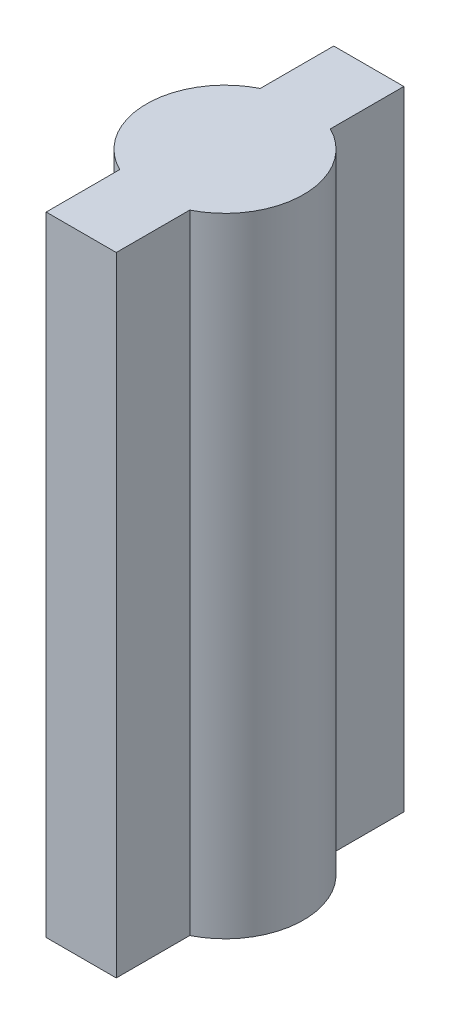
ISO-10303-21;
HEADER;
FILE_DESCRIPTION(('STEP AP214'),'2;1');
FILE_NAME('part.step','',(''),(''),'','','');
FILE_SCHEMA(('AUTOMOTIVE_DESIGN { 1 0 10303 214 1 1 1 1 }'));
ENDSEC;
DATA;
#1=APPLICATION_CONTEXT('core data for automotive mechanical design processes');
#2=APPLICATION_PROTOCOL_DEFINITION('international standard','automotive_design',2000,#1);
#3=PRODUCT_CONTEXT('',#1,'mechanical');
#4=PRODUCT('Part','Part','',(#3));
#5=PRODUCT_RELATED_PRODUCT_CATEGORY('part','',(#4));
#6=PRODUCT_DEFINITION_FORMATION('','',#4);
#7=PRODUCT_DEFINITION_CONTEXT('part definition',#1,'design');
#8=PRODUCT_DEFINITION('design','',#6,#7);
#9=PRODUCT_DEFINITION_SHAPE('','',#8);
#10=(LENGTH_UNIT() NAMED_UNIT(*) SI_UNIT(.MILLI.,.METRE.));
#11=(NAMED_UNIT(*) PLANE_ANGLE_UNIT() SI_UNIT($,.RADIAN.));
#12=(NAMED_UNIT(*) SI_UNIT($,.STERADIAN.) SOLID_ANGLE_UNIT());
#13=UNCERTAINTY_MEASURE_WITH_UNIT(LENGTH_MEASURE(1.E-05),#10,'distance_accuracy_value','');
#14=(GEOMETRIC_REPRESENTATION_CONTEXT(3) GLOBAL_UNCERTAINTY_ASSIGNED_CONTEXT((#13)) GLOBAL_UNIT_ASSIGNED_CONTEXT((#10,
#11,#12)) REPRESENTATION_CONTEXT('',''));
#15=CARTESIAN_POINT('',(0.,0.,0.));
#16=DIRECTION('',(0.,0.,1.));
#17=DIRECTION('',(1.,0.,0.));
#18=AXIS2_PLACEMENT_3D('',#15,#16,#17);
#19=CARTESIAN_POINT('',(0.,6.5,0.));
#20=DIRECTION('',(0.,-1.,0.));
#21=DIRECTION('',(0.,0.,-1.));
#22=AXIS2_PLACEMENT_3D('',#19,#20,#21);
#23=CYLINDRICAL_SURFACE('',#22,1.625);
#24=CARTESIAN_POINT('',(0.,-6.5,0.));
#25=DIRECTION('',(0.,1.,0.));
#26=DIRECTION('',(0.,0.,1.));
#27=AXIS2_PLACEMENT_3D('',#24,#25,#26);
#28=CIRCLE('',#27,1.625);
#29=CARTESIAN_POINT('',(0.725,-6.5,1.4543039572249));
#30=VERTEX_POINT('',#29);
#31=CARTESIAN_POINT('',(0.725,-6.5,-1.4543039572249));
#32=VERTEX_POINT('',#31);
#33=EDGE_CURVE('E130',#30,#32,#28,.T.);
#34=ORIENTED_EDGE('',*,*,#33,.T.);
#35=DIRECTION('',(0.,-1.,0.));
#36=VECTOR('',#35,1.);
#37=CARTESIAN_POINT('',(0.725,6.5,-1.4543039572249));
#38=LINE('',#37,#36);
#39=CARTESIAN_POINT('',(0.725,6.5,-1.4543039572249));
#40=VERTEX_POINT('',#39);
#41=EDGE_CURVE('E11',#40,#32,#38,.T.);
#42=ORIENTED_EDGE('',*,*,#41,.F.);
#43=CARTESIAN_POINT('',(0.,6.5,0.));
#44=DIRECTION('',(0.,1.,0.));
#45=DIRECTION('',(0.,0.,1.));
#46=AXIS2_PLACEMENT_3D('',#43,#44,#45);
#47=CIRCLE('',#46,1.625);
#48=CARTESIAN_POINT('',(0.725,6.5,1.4543039572249));
#49=VERTEX_POINT('',#48);
#50=EDGE_CURVE('E89',#49,#40,#47,.T.);
#51=ORIENTED_EDGE('',*,*,#50,.F.);
#52=DIRECTION('',(0.,-1.,0.));
#53=VECTOR('',#52,1.);
#54=CARTESIAN_POINT('',(0.725,6.5,1.4543039572249));
#55=LINE('',#54,#53);
#56=EDGE_CURVE('E51',#49,#30,#55,.T.);
#57=ORIENTED_EDGE('',*,*,#56,.T.);
#58=EDGE_LOOP('',(#34,#42,#51,#57));
#59=FACE_BOUND('',#58,.T.);
#60=ADVANCED_FACE('F35',(#59),#23,.T.);
#61=CARTESIAN_POINT('',(0.725,6.5,0.));
#62=DIRECTION('',(1.,0.,0.));
#63=DIRECTION('',(0.,0.,-1.));
#64=AXIS2_PLACEMENT_3D('',#61,#62,#63);
#65=PLANE('',#64);
#66=DIRECTION('',(0.,0.,1.));
#67=VECTOR('',#66,1.);
#68=CARTESIAN_POINT('',(0.725,-6.5,0.));
#69=LINE('',#68,#67);
#70=CARTESIAN_POINT('',(0.725,-6.5,-2.975));
#71=VERTEX_POINT('',#70);
#72=EDGE_CURVE('E132',#71,#32,#69,.T.);
#73=ORIENTED_EDGE('',*,*,#72,.F.);
#74=DIRECTION('',(0.,-1.,0.));
#75=VECTOR('',#74,1.);
#76=CARTESIAN_POINT('',(0.725,6.5,-2.975));
#77=LINE('',#76,#75);
#78=CARTESIAN_POINT('',(0.725,6.5,-2.975));
#79=VERTEX_POINT('',#78);
#80=EDGE_CURVE('E43',#79,#71,#77,.T.);
#81=ORIENTED_EDGE('',*,*,#80,.F.);
#82=DIRECTION('',(0.,0.,1.));
#83=VECTOR('',#82,1.);
#84=CARTESIAN_POINT('',(0.725,6.5,0.));
#85=LINE('',#84,#83);
#86=EDGE_CURVE('E179',#79,#40,#85,.T.);
#87=ORIENTED_EDGE('',*,*,#86,.T.);
#88=ORIENTED_EDGE('',*,*,#41,.T.);
#89=EDGE_LOOP('',(#73,#81,#87,#88));
#90=FACE_BOUND('',#89,.T.);
#91=ADVANCED_FACE('F164',(#90),#65,.T.);
#92=CARTESIAN_POINT('',(0.,6.5,-2.975));
#93=DIRECTION('',(0.,0.,-1.));
#94=DIRECTION('',(-1.,0.,0.));
#95=AXIS2_PLACEMENT_3D('',#92,#93,#94);
#96=PLANE('',#95);
#97=DIRECTION('',(1.,0.,0.));
#98=VECTOR('',#97,1.);
#99=CARTESIAN_POINT('',(0.,-6.5,-2.975));
#100=LINE('',#99,#98);
#101=CARTESIAN_POINT('',(-0.725,-6.5,-2.975));
#102=VERTEX_POINT('',#101);
#103=EDGE_CURVE('E135',#102,#71,#100,.T.);
#104=ORIENTED_EDGE('',*,*,#103,.F.);
#105=DIRECTION('',(0.,-1.,0.));
#106=VECTOR('',#105,1.);
#107=CARTESIAN_POINT('',(-0.725,6.5,-2.975));
#108=LINE('',#107,#106);
#109=CARTESIAN_POINT('',(-0.725,6.5,-2.975));
#110=VERTEX_POINT('',#109);
#111=EDGE_CURVE('E154',#110,#102,#108,.T.);
#112=ORIENTED_EDGE('',*,*,#111,.F.);
#113=DIRECTION('',(1.,0.,0.));
#114=VECTOR('',#113,1.);
#115=CARTESIAN_POINT('',(0.,6.5,-2.975));
#116=LINE('',#115,#114);
#117=EDGE_CURVE('E161',#110,#79,#116,.T.);
#118=ORIENTED_EDGE('',*,*,#117,.T.);
#119=ORIENTED_EDGE('',*,*,#80,.T.);
#120=EDGE_LOOP('',(#104,#112,#118,#119));
#121=FACE_BOUND('',#120,.T.);
#122=ADVANCED_FACE('F159',(#121),#96,.T.);
#123=CARTESIAN_POINT('',(-0.725,6.5,0.));
#124=DIRECTION('',(1.,0.,0.));
#125=DIRECTION('',(0.,0.,-1.));
#126=AXIS2_PLACEMENT_3D('',#123,#124,#125);
#127=PLANE('',#126);
#128=DIRECTION('',(0.,0.,1.));
#129=VECTOR('',#128,1.);
#130=CARTESIAN_POINT('',(-0.725,-6.5,0.));
#131=LINE('',#130,#129);
#132=CARTESIAN_POINT('',(-0.725,-6.5,-1.4543039572249));
#133=VERTEX_POINT('',#132);
#134=EDGE_CURVE('E138',#102,#133,#131,.T.);
#135=ORIENTED_EDGE('',*,*,#134,.T.);
#136=DIRECTION('',(0.,-1.,0.));
#137=VECTOR('',#136,1.);
#138=CARTESIAN_POINT('',(-0.725,6.5,-1.4543039572249));
#139=LINE('',#138,#137);
#140=CARTESIAN_POINT('',(-0.725,6.5,-1.4543039572249));
#141=VERTEX_POINT('',#140);
#142=EDGE_CURVE('E151',#141,#133,#139,.T.);
#143=ORIENTED_EDGE('',*,*,#142,.F.);
#144=DIRECTION('',(0.,0.,1.));
#145=VECTOR('',#144,1.);
#146=CARTESIAN_POINT('',(-0.725,6.5,0.));
#147=LINE('',#146,#145);
#148=EDGE_CURVE('E175',#110,#141,#147,.T.);
#149=ORIENTED_EDGE('',*,*,#148,.F.);
#150=ORIENTED_EDGE('',*,*,#111,.T.);
#151=EDGE_LOOP('',(#135,#143,#149,#150));
#152=FACE_BOUND('',#151,.T.);
#153=ADVANCED_FACE('F171',(#152),#127,.F.);
#154=CARTESIAN_POINT('',(0.,6.5,0.));
#155=DIRECTION('',(0.,-1.,0.));
#156=DIRECTION('',(0.,0.,-1.));
#157=AXIS2_PLACEMENT_3D('',#154,#155,#156);
#158=CYLINDRICAL_SURFACE('',#157,1.625);
#159=CARTESIAN_POINT('',(0.,-6.5,0.));
#160=DIRECTION('',(0.,1.,0.));
#161=DIRECTION('',(0.,0.,1.));
#162=AXIS2_PLACEMENT_3D('',#159,#160,#161);
#163=CIRCLE('',#162,1.625);
#164=CARTESIAN_POINT('',(-0.725,-6.5,1.4543039572249));
#165=VERTEX_POINT('',#164);
#166=EDGE_CURVE('E140',#133,#165,#163,.T.);
#167=ORIENTED_EDGE('',*,*,#166,.T.);
#168=DIRECTION('',(0.,-1.,0.));
#169=VECTOR('',#168,1.);
#170=CARTESIAN_POINT('',(-0.725,6.5,1.4543039572249));
#171=LINE('',#170,#169);
#172=CARTESIAN_POINT('',(-0.725,6.5,1.4543039572249));
#173=VERTEX_POINT('',#172);
#174=EDGE_CURVE('E122',#173,#165,#171,.T.);
#175=ORIENTED_EDGE('',*,*,#174,.F.);
#176=CARTESIAN_POINT('',(0.,6.5,0.));
#177=DIRECTION('',(0.,1.,0.));
#178=DIRECTION('',(0.,0.,1.));
#179=AXIS2_PLACEMENT_3D('',#176,#177,#178);
#180=CIRCLE('',#179,1.625);
#181=EDGE_CURVE('E110',#141,#173,#180,.T.);
#182=ORIENTED_EDGE('',*,*,#181,.F.);
#183=ORIENTED_EDGE('',*,*,#142,.T.);
#184=EDGE_LOOP('',(#167,#175,#182,#183));
#185=FACE_BOUND('',#184,.T.);
#186=ADVANCED_FACE('F174',(#185),#158,.T.);
#187=CARTESIAN_POINT('',(-0.725,6.5,0.));
#188=DIRECTION('',(1.,0.,0.));
#189=DIRECTION('',(0.,0.,-1.));
#190=AXIS2_PLACEMENT_3D('',#187,#188,#189);
#191=PLANE('',#190);
#192=DIRECTION('',(0.,0.,1.));
#193=VECTOR('',#192,1.);
#194=CARTESIAN_POINT('',(-0.725,-6.5,0.));
#195=LINE('',#194,#193);
#196=CARTESIAN_POINT('',(-0.724999999999999,-6.5,2.975));
#197=VERTEX_POINT('',#196);
#198=EDGE_CURVE('E119',#165,#197,#195,.T.);
#199=ORIENTED_EDGE('',*,*,#198,.T.);
#200=DIRECTION('',(0.,-1.,0.));
#201=VECTOR('',#200,1.);
#202=CARTESIAN_POINT('',(-0.724999999999999,6.5,2.975));
#203=LINE('',#202,#201);
#204=CARTESIAN_POINT('',(-0.724999999999999,6.5,2.975));
#205=VERTEX_POINT('',#204);
#206=EDGE_CURVE('E116',#205,#197,#203,.T.);
#207=ORIENTED_EDGE('',*,*,#206,.F.);
#208=DIRECTION('',(0.,0.,1.));
#209=VECTOR('',#208,1.);
#210=CARTESIAN_POINT('',(-0.725,6.5,0.));
#211=LINE('',#210,#209);
#212=EDGE_CURVE('E104',#173,#205,#211,.T.);
#213=ORIENTED_EDGE('',*,*,#212,.F.);
#214=ORIENTED_EDGE('',*,*,#174,.T.);
#215=EDGE_LOOP('',(#199,#207,#213,#214));
#216=FACE_BOUND('',#215,.T.);
#217=ADVANCED_FACE('F117',(#216),#191,.F.);
#218=CARTESIAN_POINT('',(0.,6.5,2.975));
#219=DIRECTION('',(0.,0.,-1.));
#220=DIRECTION('',(-1.,0.,0.));
#221=AXIS2_PLACEMENT_3D('',#218,#219,#220);
#222=PLANE('',#221);
#223=DIRECTION('',(1.,0.,0.));
#224=VECTOR('',#223,1.);
#225=CARTESIAN_POINT('',(0.,-6.5,2.975));
#226=LINE('',#225,#224);
#227=CARTESIAN_POINT('',(0.725,-6.5,2.975));
#228=VERTEX_POINT('',#227);
#229=EDGE_CURVE('E143',#197,#228,#226,.T.);
#230=ORIENTED_EDGE('',*,*,#229,.T.);
#231=DIRECTION('',(0.,-1.,0.));
#232=VECTOR('',#231,1.);
#233=CARTESIAN_POINT('',(0.725,6.5,2.975));
#234=LINE('',#233,#232);
#235=CARTESIAN_POINT('',(0.725,6.5,2.975));
#236=VERTEX_POINT('',#235);
#237=EDGE_CURVE('E77',#236,#228,#234,.T.);
#238=ORIENTED_EDGE('',*,*,#237,.F.);
#239=DIRECTION('',(1.,0.,0.));
#240=VECTOR('',#239,1.);
#241=CARTESIAN_POINT('',(0.,6.5,2.975));
#242=LINE('',#241,#240);
#243=EDGE_CURVE('E108',#205,#236,#242,.T.);
#244=ORIENTED_EDGE('',*,*,#243,.F.);
#245=ORIENTED_EDGE('',*,*,#206,.T.);
#246=EDGE_LOOP('',(#230,#238,#244,#245));
#247=FACE_BOUND('',#246,.T.);
#248=ADVANCED_FACE('F124',(#247),#222,.F.);
#249=CARTESIAN_POINT('',(0.725,6.5,0.));
#250=DIRECTION('',(1.,0.,0.));
#251=DIRECTION('',(0.,0.,-1.));
#252=AXIS2_PLACEMENT_3D('',#249,#250,#251);
#253=PLANE('',#252);
#254=DIRECTION('',(0.,0.,1.));
#255=VECTOR('',#254,1.);
#256=CARTESIAN_POINT('',(0.725,-6.5,0.));
#257=LINE('',#256,#255);
#258=EDGE_CURVE('E145',#30,#228,#257,.T.);
#259=ORIENTED_EDGE('',*,*,#258,.F.);
#260=ORIENTED_EDGE('',*,*,#56,.F.);
#261=DIRECTION('',(0.,0.,1.));
#262=VECTOR('',#261,1.);
#263=CARTESIAN_POINT('',(0.725,6.5,0.));
#264=LINE('',#263,#262);
#265=EDGE_CURVE('E125',#49,#236,#264,.T.);
#266=ORIENTED_EDGE('',*,*,#265,.T.);
#267=ORIENTED_EDGE('',*,*,#237,.T.);
#268=EDGE_LOOP('',(#259,#260,#266,#267));
#269=FACE_BOUND('',#268,.T.);
#270=ADVANCED_FACE('F181',(#269),#253,.T.);
#271=CARTESIAN_POINT('',(0.,6.5,0.));
#272=DIRECTION('',(0.,1.,0.));
#273=DIRECTION('',(0.,0.,1.));
#274=AXIS2_PLACEMENT_3D('',#271,#272,#273);
#275=PLANE('',#274);
#276=ORIENTED_EDGE('',*,*,#50,.T.);
#277=ORIENTED_EDGE('',*,*,#86,.F.);
#278=ORIENTED_EDGE('',*,*,#117,.F.);
#279=ORIENTED_EDGE('',*,*,#148,.T.);
#280=ORIENTED_EDGE('',*,*,#181,.T.);
#281=ORIENTED_EDGE('',*,*,#212,.T.);
#282=ORIENTED_EDGE('',*,*,#243,.T.);
#283=ORIENTED_EDGE('',*,*,#265,.F.);
#284=EDGE_LOOP('',(#276,#277,#278,#279,#280,#281,#282,#283));
#285=FACE_BOUND('',#284,.T.);
#286=ADVANCED_FACE('F106',(#285),#275,.T.);
#287=CARTESIAN_POINT('',(0.,-6.5,0.));
#288=DIRECTION('',(0.,1.,0.));
#289=DIRECTION('',(0.,0.,1.));
#290=AXIS2_PLACEMENT_3D('',#287,#288,#289);
#291=PLANE('',#290);
#292=ORIENTED_EDGE('',*,*,#33,.F.);
#293=ORIENTED_EDGE('',*,*,#258,.T.);
#294=ORIENTED_EDGE('',*,*,#229,.F.);
#295=ORIENTED_EDGE('',*,*,#198,.F.);
#296=ORIENTED_EDGE('',*,*,#166,.F.);
#297=ORIENTED_EDGE('',*,*,#134,.F.);
#298=ORIENTED_EDGE('',*,*,#103,.T.);
#299=ORIENTED_EDGE('',*,*,#72,.T.);
#300=EDGE_LOOP('',(#292,#293,#294,#295,#296,#297,#298,#299));
#301=FACE_BOUND('',#300,.T.);
#302=ADVANCED_FACE('F167',(#301),#291,.F.);
#303=CLOSED_SHELL('',(#60,#91,#122,#153,#186,#217,#248,#270,#286,#302));
#304=MANIFOLD_SOLID_BREP('B2',#303);
#305=ADVANCED_BREP_SHAPE_REPRESENTATION('',(#18,#304),#14);
#306=SHAPE_DEFINITION_REPRESENTATION(#9,#305);
ENDSEC;
END-ISO-10303-21;
